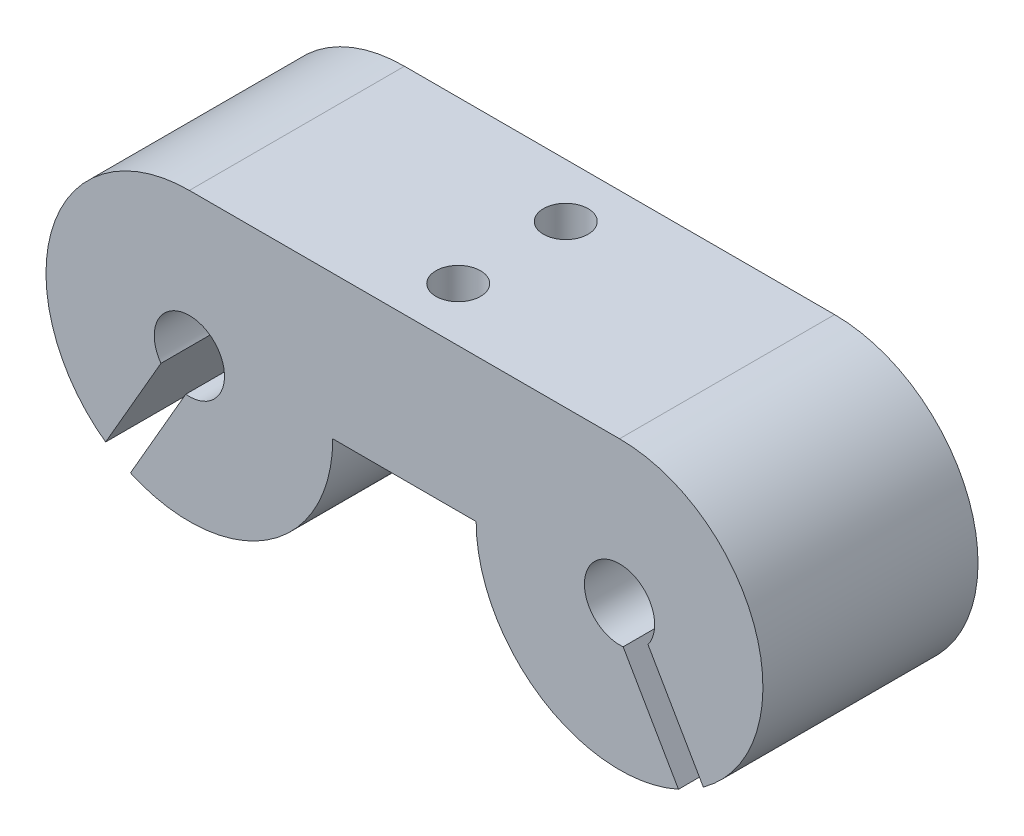
ISO-10303-21;
HEADER;
FILE_DESCRIPTION(('STEP AP214'),'2;1');
FILE_NAME('part.step','',(''),(''),'','','');
FILE_SCHEMA(('AUTOMOTIVE_DESIGN { 1 0 10303 214 1 1 1 1 }'));
ENDSEC;
DATA;
#1=APPLICATION_CONTEXT('core data for automotive mechanical design processes');
#2=APPLICATION_PROTOCOL_DEFINITION('international standard','automotive_design',2000,#1);
#3=PRODUCT_CONTEXT('',#1,'mechanical');
#4=PRODUCT('Part','Part','',(#3));
#5=PRODUCT_RELATED_PRODUCT_CATEGORY('part','',(#4));
#6=PRODUCT_DEFINITION_FORMATION('','',#4);
#7=PRODUCT_DEFINITION_CONTEXT('part definition',#1,'design');
#8=PRODUCT_DEFINITION('design','',#6,#7);
#9=PRODUCT_DEFINITION_SHAPE('','',#8);
#10=(LENGTH_UNIT() NAMED_UNIT(*) SI_UNIT(.MILLI.,.METRE.));
#11=(NAMED_UNIT(*) PLANE_ANGLE_UNIT() SI_UNIT($,.RADIAN.));
#12=(NAMED_UNIT(*) SI_UNIT($,.STERADIAN.) SOLID_ANGLE_UNIT());
#13=UNCERTAINTY_MEASURE_WITH_UNIT(LENGTH_MEASURE(1.E-05),#10,'distance_accuracy_value','');
#14=(GEOMETRIC_REPRESENTATION_CONTEXT(3) GLOBAL_UNCERTAINTY_ASSIGNED_CONTEXT((#13)) GLOBAL_UNIT_ASSIGNED_CONTEXT((#10,
#11,#12)) REPRESENTATION_CONTEXT('',''));
#15=CARTESIAN_POINT('',(0.,0.,0.));
#16=DIRECTION('',(0.,0.,1.));
#17=DIRECTION('',(1.,0.,0.));
#18=AXIS2_PLACEMENT_3D('',#15,#16,#17);
#19=CARTESIAN_POINT('',(15.,0.,15.));
#20=DIRECTION('',(0.,0.,-1.));
#21=DIRECTION('',(-1.,0.,0.));
#22=AXIS2_PLACEMENT_3D('',#19,#20,#21);
#23=CYLINDRICAL_SURFACE('',#22,10.);
#24=CARTESIAN_POINT('',(15.,0.,0.));
#25=DIRECTION('',(0.,0.,1.));
#26=DIRECTION('',(1.,0.,0.));
#27=AXIS2_PLACEMENT_3D('',#24,#25,#26);
#28=CIRCLE('',#27,10.);
#29=CARTESIAN_POINT('',(5.,0.,0.));
#30=VERTEX_POINT('',#29);
#31=CARTESIAN_POINT('',(19.1089117817486,-9.11684396980705,0.));
#32=VERTEX_POINT('',#31);
#33=EDGE_CURVE('E169',#30,#32,#28,.T.);
#34=ORIENTED_EDGE('',*,*,#33,.T.);
#35=DIRECTION('',(0.,0.,-1.));
#36=VECTOR('',#35,1.);
#37=CARTESIAN_POINT('',(19.1089117817486,-9.11684396980705,15.));
#38=LINE('',#37,#36);
#39=CARTESIAN_POINT('',(19.1089117817486,-9.11684396980705,15.));
#40=VERTEX_POINT('',#39);
#41=EDGE_CURVE('E207',#32,#40,#38,.F.);
#42=ORIENTED_EDGE('',*,*,#41,.T.);
#43=CARTESIAN_POINT('',(15.,0.,15.));
#44=DIRECTION('',(0.,0.,1.));
#45=DIRECTION('',(1.,0.,0.));
#46=AXIS2_PLACEMENT_3D('',#43,#44,#45);
#47=CIRCLE('',#46,10.);
#48=CARTESIAN_POINT('',(5.,0.,15.));
#49=VERTEX_POINT('',#48);
#50=EDGE_CURVE('E132',#49,#40,#47,.T.);
#51=ORIENTED_EDGE('',*,*,#50,.F.);
#52=DIRECTION('',(0.,0.,-1.));
#53=VECTOR('',#52,1.);
#54=CARTESIAN_POINT('',(5.,0.,15.));
#55=LINE('',#54,#53);
#56=EDGE_CURVE('E175',#49,#30,#55,.T.);
#57=ORIENTED_EDGE('',*,*,#56,.T.);
#58=EDGE_LOOP('',(#34,#42,#51,#57));
#59=FACE_BOUND('',#58,.T.);
#60=ADVANCED_FACE('F33',(#59),#23,.T.);
#61=CARTESIAN_POINT('',(-15.,0.,15.));
#62=DIRECTION('',(0.,0.,-1.));
#63=DIRECTION('',(-1.,0.,0.));
#64=AXIS2_PLACEMENT_3D('',#61,#62,#63);
#65=CYLINDRICAL_SURFACE('',#64,10.);
#66=CARTESIAN_POINT('',(-15.,0.,15.));
#67=DIRECTION('',(0.,0.,1.));
#68=DIRECTION('',(1.,0.,0.));
#69=AXIS2_PLACEMENT_3D('',#66,#67,#68);
#70=CIRCLE('',#69,10.);
#71=CARTESIAN_POINT('',(-19.1089117817487,-9.11684396980703,15.));
#72=VERTEX_POINT('',#71);
#73=CARTESIAN_POINT('',(-5.,0.,15.));
#74=VERTEX_POINT('',#73);
#75=EDGE_CURVE('E153',#72,#74,#70,.T.);
#76=ORIENTED_EDGE('',*,*,#75,.F.);
#77=DIRECTION('',(0.,0.,-1.));
#78=VECTOR('',#77,1.);
#79=CARTESIAN_POINT('',(-19.1089117817487,-9.11684396980702,15.));
#80=LINE('',#79,#78);
#81=CARTESIAN_POINT('',(-19.1089117817487,-9.11684396980703,0.));
#82=VERTEX_POINT('',#81);
#83=EDGE_CURVE('E137',#72,#82,#80,.T.);
#84=ORIENTED_EDGE('',*,*,#83,.T.);
#85=CARTESIAN_POINT('',(-15.,0.,0.));
#86=DIRECTION('',(0.,0.,1.));
#87=DIRECTION('',(1.,0.,0.));
#88=AXIS2_PLACEMENT_3D('',#85,#86,#87);
#89=CIRCLE('',#88,10.);
#90=CARTESIAN_POINT('',(-5.,0.,0.));
#91=VERTEX_POINT('',#90);
#92=EDGE_CURVE('E148',#82,#91,#89,.T.);
#93=ORIENTED_EDGE('',*,*,#92,.T.);
#94=DIRECTION('',(0.,0.,-1.));
#95=VECTOR('',#94,1.);
#96=CARTESIAN_POINT('',(-5.,0.,15.));
#97=LINE('',#96,#95);
#98=EDGE_CURVE('E178',#74,#91,#97,.T.);
#99=ORIENTED_EDGE('',*,*,#98,.F.);
#100=EDGE_LOOP('',(#76,#84,#93,#99));
#101=FACE_BOUND('',#100,.T.);
#102=ADVANCED_FACE('F264',(#101),#65,.T.);
#103=CARTESIAN_POINT('',(-15.,10.,0.));
#104=VERTEX_POINT('',#103);
#105=CARTESIAN_POINT('',(-20.8409625893176,-8.11684396980702,0.));
#106=VERTEX_POINT('',#105);
#107=EDGE_CURVE('E163',#104,#106,#89,.T.);
#108=ORIENTED_EDGE('',*,*,#107,.T.);
#109=DIRECTION('',(0.,0.,-1.));
#110=VECTOR('',#109,1.);
#111=CARTESIAN_POINT('',(-20.8409625893176,-8.11684396980702,15.));
#112=LINE('',#111,#110);
#113=CARTESIAN_POINT('',(-20.8409625893176,-8.11684396980702,15.));
#114=VERTEX_POINT('',#113);
#115=EDGE_CURVE('E142',#106,#114,#112,.F.);
#116=ORIENTED_EDGE('',*,*,#115,.T.);
#117=CARTESIAN_POINT('',(-15.,10.,15.));
#118=VERTEX_POINT('',#117);
#119=EDGE_CURVE('E155',#118,#114,#70,.T.);
#120=ORIENTED_EDGE('',*,*,#119,.F.);
#121=DIRECTION('',(0.,0.,-1.));
#122=VECTOR('',#121,1.);
#123=CARTESIAN_POINT('',(-15.,10.,15.));
#124=LINE('',#123,#122);
#125=EDGE_CURVE('E181',#118,#104,#124,.T.);
#126=ORIENTED_EDGE('',*,*,#125,.T.);
#127=EDGE_LOOP('',(#108,#116,#120,#126));
#128=FACE_BOUND('',#127,.T.);
#129=ADVANCED_FACE('F35',(#128),#65,.T.);
#130=CARTESIAN_POINT('',(-5.,0.,15.));
#131=DIRECTION('',(0.,1.,0.));
#132=DIRECTION('',(0.,0.,1.));
#133=AXIS2_PLACEMENT_3D('',#130,#131,#132);
#134=PLANE('',#133);
#135=CARTESIAN_POINT('',(0.,0.,3.75));
#136=DIRECTION('',(0.,-1.,0.));
#137=DIRECTION('',(0.,0.,-1.));
#138=AXIS2_PLACEMENT_3D('',#135,#136,#137);
#139=CIRCLE('',#138,1.55399999999999);
#140=CARTESIAN_POINT('',(0.,0.,2.19600000000001));
#141=VERTEX_POINT('',#140);
#142=EDGE_CURVE('E233',#141,#141,#139,.T.);
#143=ORIENTED_EDGE('',*,*,#142,.F.);
#144=EDGE_LOOP('',(#143));
#145=FACE_BOUND('',#144,.T.);
#146=CARTESIAN_POINT('',(0.,0.,11.25));
#147=DIRECTION('',(0.,-1.,0.));
#148=DIRECTION('',(0.,0.,-1.));
#149=AXIS2_PLACEMENT_3D('',#146,#147,#148);
#150=CIRCLE('',#149,1.55399999999999);
#151=CARTESIAN_POINT('',(0.,0.,9.69600000000001));
#152=VERTEX_POINT('',#151);
#153=EDGE_CURVE('E227',#152,#152,#150,.T.);
#154=ORIENTED_EDGE('',*,*,#153,.F.);
#155=EDGE_LOOP('',(#154));
#156=FACE_BOUND('',#155,.T.);
#157=DIRECTION('',(1.,0.,0.));
#158=VECTOR('',#157,1.);
#159=CARTESIAN_POINT('',(-5.,0.,0.));
#160=LINE('',#159,#158);
#161=EDGE_CURVE('E166',#91,#30,#160,.T.);
#162=ORIENTED_EDGE('',*,*,#161,.T.);
#163=ORIENTED_EDGE('',*,*,#56,.F.);
#164=DIRECTION('',(1.,0.,0.));
#165=VECTOR('',#164,1.);
#166=CARTESIAN_POINT('',(-5.,0.,15.));
#167=LINE('',#166,#165);
#168=EDGE_CURVE('E158',#74,#49,#167,.T.);
#169=ORIENTED_EDGE('',*,*,#168,.F.);
#170=ORIENTED_EDGE('',*,*,#98,.T.);
#171=EDGE_LOOP('',(#162,#163,#169,#170));
#172=FACE_BOUND('',#171,.T.);
#173=ADVANCED_FACE('F239',(#145,#156,#172),#134,.F.);
#174=CARTESIAN_POINT('',(20.8409625893175,-8.11684396980705,15.));
#175=VERTEX_POINT('',#174);
#176=CARTESIAN_POINT('',(15.,10.,15.));
#177=VERTEX_POINT('',#176);
#178=EDGE_CURVE('E160',#175,#177,#47,.T.);
#179=ORIENTED_EDGE('',*,*,#178,.F.);
#180=DIRECTION('',(0.,0.,-1.));
#181=VECTOR('',#180,1.);
#182=CARTESIAN_POINT('',(20.8409625893175,-8.11684396980705,15.));
#183=LINE('',#182,#181);
#184=CARTESIAN_POINT('',(20.8409625893175,-8.11684396980705,0.));
#185=VERTEX_POINT('',#184);
#186=EDGE_CURVE('E217',#175,#185,#183,.T.);
#187=ORIENTED_EDGE('',*,*,#186,.T.);
#188=CARTESIAN_POINT('',(15.,10.,0.));
#189=VERTEX_POINT('',#188);
#190=EDGE_CURVE('E168',#185,#189,#28,.T.);
#191=ORIENTED_EDGE('',*,*,#190,.T.);
#192=DIRECTION('',(0.,0.,-1.));
#193=VECTOR('',#192,1.);
#194=CARTESIAN_POINT('',(15.,10.,15.));
#195=LINE('',#194,#193);
#196=EDGE_CURVE('E162',#177,#189,#195,.T.);
#197=ORIENTED_EDGE('',*,*,#196,.F.);
#198=EDGE_LOOP('',(#179,#187,#191,#197));
#199=FACE_BOUND('',#198,.T.);
#200=ADVANCED_FACE('F242',(#199),#23,.T.);
#201=CARTESIAN_POINT('',(5.,10.,15.));
#202=DIRECTION('',(0.,-1.,0.));
#203=DIRECTION('',(1.,0.,0.));
#204=AXIS2_PLACEMENT_3D('',#201,#202,#203);
#205=PLANE('',#204);
#206=CARTESIAN_POINT('',(0.,10.,3.75));
#207=DIRECTION('',(0.,-1.,0.));
#208=DIRECTION('',(0.,0.,-1.));
#209=AXIS2_PLACEMENT_3D('',#206,#207,#208);
#210=CIRCLE('',#209,1.554);
#211=CARTESIAN_POINT('',(0.,10.,2.196));
#212=VERTEX_POINT('',#211);
#213=EDGE_CURVE('E230',#212,#212,#210,.T.);
#214=ORIENTED_EDGE('',*,*,#213,.T.);
#215=EDGE_LOOP('',(#214));
#216=FACE_BOUND('',#215,.T.);
#217=CARTESIAN_POINT('',(0.,10.,11.25));
#218=DIRECTION('',(0.,-1.,0.));
#219=DIRECTION('',(0.,0.,-1.));
#220=AXIS2_PLACEMENT_3D('',#217,#218,#219);
#221=CIRCLE('',#220,1.554);
#222=CARTESIAN_POINT('',(0.,10.,9.696));
#223=VERTEX_POINT('',#222);
#224=EDGE_CURVE('E133',#223,#223,#221,.T.);
#225=ORIENTED_EDGE('',*,*,#224,.T.);
#226=EDGE_LOOP('',(#225));
#227=FACE_BOUND('',#226,.T.);
#228=DIRECTION('',(-1.,0.,0.));
#229=VECTOR('',#228,1.);
#230=CARTESIAN_POINT('',(5.,10.,0.));
#231=LINE('',#230,#229);
#232=EDGE_CURVE('E154',#189,#104,#231,.T.);
#233=ORIENTED_EDGE('',*,*,#232,.T.);
#234=ORIENTED_EDGE('',*,*,#125,.F.);
#235=DIRECTION('',(-1.,0.,0.));
#236=VECTOR('',#235,1.);
#237=CARTESIAN_POINT('',(-5.,10.,15.));
#238=LINE('',#237,#236);
#239=EDGE_CURVE('E151',#177,#118,#238,.T.);
#240=ORIENTED_EDGE('',*,*,#239,.F.);
#241=ORIENTED_EDGE('',*,*,#196,.T.);
#242=EDGE_LOOP('',(#233,#234,#240,#241));
#243=FACE_BOUND('',#242,.T.);
#244=ADVANCED_FACE('F262',(#216,#227,#243),#205,.F.);
#245=CARTESIAN_POINT('',(15.,0.,15.));
#246=DIRECTION('',(0.,0.,1.));
#247=DIRECTION('',(1.,0.,0.));
#248=AXIS2_PLACEMENT_3D('',#245,#246,#247);
#249=PLANE('',#248);
#250=DIRECTION('',(0.499999999999998,-0.86602540378444,0.));
#251=VECTOR('',#250,1.);
#252=CARTESIAN_POINT('',(14.1339745962156,-0.499999999999997,15.));
#253=LINE('',#252,#251);
#254=CARTESIAN_POINT('',(15.2522880585328,-2.43697573552175,15.));
#255=VERTEX_POINT('',#254);
#256=EDGE_CURVE('E120',#255,#40,#253,.T.);
#257=ORIENTED_EDGE('',*,*,#256,.F.);
#258=CARTESIAN_POINT('',(15.,0.,15.));
#259=DIRECTION('',(0.,0.,1.));
#260=DIRECTION('',(1.,0.,0.));
#261=AXIS2_PLACEMENT_3D('',#258,#259,#260);
#262=CIRCLE('',#261,2.45);
#263=CARTESIAN_POINT('',(16.9843388661017,-1.43697573552175,15.));
#264=VERTEX_POINT('',#263);
#265=EDGE_CURVE('E130',#264,#255,#262,.T.);
#266=ORIENTED_EDGE('',*,*,#265,.F.);
#267=DIRECTION('',(-0.499999999999998,0.86602540378444,0.));
#268=VECTOR('',#267,1.);
#269=CARTESIAN_POINT('',(15.8660254037844,0.499999999999998,15.));
#270=LINE('',#269,#268);
#271=EDGE_CURVE('E48',#175,#264,#270,.T.);
#272=ORIENTED_EDGE('',*,*,#271,.F.);
#273=ORIENTED_EDGE('',*,*,#178,.T.);
#274=ORIENTED_EDGE('',*,*,#239,.T.);
#275=ORIENTED_EDGE('',*,*,#119,.T.);
#276=DIRECTION('',(-0.500000000000004,-0.866025403784436,0.));
#277=VECTOR('',#276,1.);
#278=CARTESIAN_POINT('',(-15.8660254037844,0.500000000000004,15.));
#279=LINE('',#278,#277);
#280=CARTESIAN_POINT('',(-16.9843388661017,-1.43697573552174,15.));
#281=VERTEX_POINT('',#280);
#282=EDGE_CURVE('E199',#281,#114,#279,.T.);
#283=ORIENTED_EDGE('',*,*,#282,.F.);
#284=CARTESIAN_POINT('',(-15.,0.,15.));
#285=DIRECTION('',(0.,0.,1.));
#286=DIRECTION('',(1.,0.,0.));
#287=AXIS2_PLACEMENT_3D('',#284,#285,#286);
#288=CIRCLE('',#287,2.45);
#289=CARTESIAN_POINT('',(-15.2522880585328,-2.43697573552174,15.));
#290=VERTEX_POINT('',#289);
#291=EDGE_CURVE('E139',#290,#281,#288,.T.);
#292=ORIENTED_EDGE('',*,*,#291,.F.);
#293=DIRECTION('',(0.500000000000004,0.866025403784436,0.));
#294=VECTOR('',#293,1.);
#295=CARTESIAN_POINT('',(-14.1339745962156,-0.500000000000002,15.));
#296=LINE('',#295,#294);
#297=EDGE_CURVE('E197',#72,#290,#296,.T.);
#298=ORIENTED_EDGE('',*,*,#297,.F.);
#299=ORIENTED_EDGE('',*,*,#75,.T.);
#300=ORIENTED_EDGE('',*,*,#168,.T.);
#301=ORIENTED_EDGE('',*,*,#50,.T.);
#302=EDGE_LOOP('',(#257,#266,#272,#273,#274,#275,#283,#292,#298,#299,#300,#301));
#303=FACE_BOUND('',#302,.T.);
#304=ADVANCED_FACE('F129',(#303),#249,.T.);
#305=CARTESIAN_POINT('',(15.,0.,0.));
#306=DIRECTION('',(0.,0.,1.));
#307=DIRECTION('',(1.,0.,0.));
#308=AXIS2_PLACEMENT_3D('',#305,#306,#307);
#309=PLANE('',#308);
#310=CARTESIAN_POINT('',(15.,0.,0.));
#311=DIRECTION('',(0.,0.,1.));
#312=DIRECTION('',(1.,0.,0.));
#313=AXIS2_PLACEMENT_3D('',#310,#311,#312);
#314=CIRCLE('',#313,2.45);
#315=CARTESIAN_POINT('',(16.9843388661017,-1.43697573552175,0.));
#316=VERTEX_POINT('',#315);
#317=CARTESIAN_POINT('',(15.2522880585328,-2.43697573552175,0.));
#318=VERTEX_POINT('',#317);
#319=EDGE_CURVE('E136',#316,#318,#314,.T.);
#320=ORIENTED_EDGE('',*,*,#319,.T.);
#321=DIRECTION('',(0.499999999999998,-0.86602540378444,0.));
#322=VECTOR('',#321,1.);
#323=CARTESIAN_POINT('',(14.1339745962156,-0.499999999999997,0.));
#324=LINE('',#323,#322);
#325=EDGE_CURVE('E56',#318,#32,#324,.T.);
#326=ORIENTED_EDGE('',*,*,#325,.T.);
#327=ORIENTED_EDGE('',*,*,#33,.F.);
#328=ORIENTED_EDGE('',*,*,#161,.F.);
#329=ORIENTED_EDGE('',*,*,#92,.F.);
#330=DIRECTION('',(0.500000000000004,0.866025403784436,0.));
#331=VECTOR('',#330,1.);
#332=CARTESIAN_POINT('',(-14.1339745962156,-0.500000000000002,0.));
#333=LINE('',#332,#331);
#334=CARTESIAN_POINT('',(-15.2522880585328,-2.43697573552174,0.));
#335=VERTEX_POINT('',#334);
#336=EDGE_CURVE('E203',#82,#335,#333,.T.);
#337=ORIENTED_EDGE('',*,*,#336,.T.);
#338=CARTESIAN_POINT('',(-15.,0.,0.));
#339=DIRECTION('',(0.,0.,1.));
#340=DIRECTION('',(1.,0.,0.));
#341=AXIS2_PLACEMENT_3D('',#338,#339,#340);
#342=CIRCLE('',#341,2.45);
#343=CARTESIAN_POINT('',(-16.9843388661017,-1.43697573552174,0.));
#344=VERTEX_POINT('',#343);
#345=EDGE_CURVE('E145',#335,#344,#342,.T.);
#346=ORIENTED_EDGE('',*,*,#345,.T.);
#347=DIRECTION('',(-0.500000000000004,-0.866025403784436,0.));
#348=VECTOR('',#347,1.);
#349=CARTESIAN_POINT('',(-15.8660254037844,0.500000000000004,0.));
#350=LINE('',#349,#348);
#351=EDGE_CURVE('E205',#344,#106,#350,.T.);
#352=ORIENTED_EDGE('',*,*,#351,.T.);
#353=ORIENTED_EDGE('',*,*,#107,.F.);
#354=ORIENTED_EDGE('',*,*,#232,.F.);
#355=ORIENTED_EDGE('',*,*,#190,.F.);
#356=DIRECTION('',(-0.499999999999998,0.86602540378444,0.));
#357=VECTOR('',#356,1.);
#358=CARTESIAN_POINT('',(15.8660254037844,0.499999999999998,0.));
#359=LINE('',#358,#357);
#360=EDGE_CURVE('E220',#185,#316,#359,.T.);
#361=ORIENTED_EDGE('',*,*,#360,.T.);
#362=EDGE_LOOP('',(#320,#326,#327,#328,#329,#337,#346,#352,#353,#354,#355,#361));
#363=FACE_BOUND('',#362,.T.);
#364=ADVANCED_FACE('F252',(#363),#309,.F.);
#365=CARTESIAN_POINT('',(-15.,0.,0.));
#366=DIRECTION('',(0.,0.,1.));
#367=DIRECTION('',(1.,0.,0.));
#368=AXIS2_PLACEMENT_3D('',#365,#366,#367);
#369=CYLINDRICAL_SURFACE('',#368,2.45);
#370=ORIENTED_EDGE('',*,*,#345,.F.);
#371=DIRECTION('',(0.,0.,1.));
#372=VECTOR('',#371,1.);
#373=CARTESIAN_POINT('',(-15.2522880585328,-2.43697573552174,0.));
#374=LINE('',#373,#372);
#375=EDGE_CURVE('E187',#335,#290,#374,.T.);
#376=ORIENTED_EDGE('',*,*,#375,.T.);
#377=ORIENTED_EDGE('',*,*,#291,.T.);
#378=DIRECTION('',(0.,0.,1.));
#379=VECTOR('',#378,1.);
#380=CARTESIAN_POINT('',(-16.9843388661017,-1.43697573552174,0.));
#381=LINE('',#380,#379);
#382=EDGE_CURVE('E184',#281,#344,#381,.F.);
#383=ORIENTED_EDGE('',*,*,#382,.T.);
#384=EDGE_LOOP('',(#370,#376,#377,#383));
#385=FACE_BOUND('',#384,.T.);
#386=ADVANCED_FACE('F192',(#385),#369,.F.);
#387=CARTESIAN_POINT('',(15.,0.,0.));
#388=DIRECTION('',(0.,0.,1.));
#389=DIRECTION('',(1.,0.,0.));
#390=AXIS2_PLACEMENT_3D('',#387,#388,#389);
#391=CYLINDRICAL_SURFACE('',#390,2.45);
#392=ORIENTED_EDGE('',*,*,#265,.T.);
#393=DIRECTION('',(0.,0.,1.));
#394=VECTOR('',#393,1.);
#395=CARTESIAN_POINT('',(15.2522880585328,-2.43697573552175,0.));
#396=LINE('',#395,#394);
#397=EDGE_CURVE('E11',#255,#318,#396,.F.);
#398=ORIENTED_EDGE('',*,*,#397,.T.);
#399=ORIENTED_EDGE('',*,*,#319,.F.);
#400=DIRECTION('',(0.,0.,1.));
#401=VECTOR('',#400,1.);
#402=CARTESIAN_POINT('',(16.9843388661017,-1.43697573552175,0.));
#403=LINE('',#402,#401);
#404=EDGE_CURVE('E41',#316,#264,#403,.T.);
#405=ORIENTED_EDGE('',*,*,#404,.T.);
#406=EDGE_LOOP('',(#392,#398,#399,#405));
#407=FACE_BOUND('',#406,.T.);
#408=ADVANCED_FACE('F135',(#407),#391,.F.);
#409=CARTESIAN_POINT('',(-15.8660254037844,0.500000000000004,0.));
#410=DIRECTION('',(-0.866025403784436,0.500000000000004,0.));
#411=DIRECTION('',(-0.500000000000004,-0.866025403784437,0.));
#412=AXIS2_PLACEMENT_3D('',#409,#410,#411);
#413=PLANE('',#412);
#414=ORIENTED_EDGE('',*,*,#351,.F.);
#415=ORIENTED_EDGE('',*,*,#382,.F.);
#416=ORIENTED_EDGE('',*,*,#282,.T.);
#417=ORIENTED_EDGE('',*,*,#115,.F.);
#418=EDGE_LOOP('',(#414,#415,#416,#417));
#419=FACE_BOUND('',#418,.T.);
#420=ADVANCED_FACE('F293',(#419),#413,.F.);
#421=CARTESIAN_POINT('',(-14.1339745962156,-0.500000000000002,0.));
#422=DIRECTION('',(0.866025403784436,-0.500000000000004,0.));
#423=DIRECTION('',(0.500000000000004,0.866025403784436,0.));
#424=AXIS2_PLACEMENT_3D('',#421,#422,#423);
#425=PLANE('',#424);
#426=ORIENTED_EDGE('',*,*,#297,.T.);
#427=ORIENTED_EDGE('',*,*,#375,.F.);
#428=ORIENTED_EDGE('',*,*,#336,.F.);
#429=ORIENTED_EDGE('',*,*,#83,.F.);
#430=EDGE_LOOP('',(#426,#427,#428,#429));
#431=FACE_BOUND('',#430,.T.);
#432=ADVANCED_FACE('F294',(#431),#425,.F.);
#433=CARTESIAN_POINT('',(15.8660254037844,0.499999999999998,0.));
#434=DIRECTION('',(0.86602540378444,0.499999999999998,0.));
#435=DIRECTION('',(-0.499999999999998,0.86602540378444,0.));
#436=AXIS2_PLACEMENT_3D('',#433,#434,#435);
#437=PLANE('',#436);
#438=ORIENTED_EDGE('',*,*,#271,.T.);
#439=ORIENTED_EDGE('',*,*,#404,.F.);
#440=ORIENTED_EDGE('',*,*,#360,.F.);
#441=ORIENTED_EDGE('',*,*,#186,.F.);
#442=EDGE_LOOP('',(#438,#439,#440,#441));
#443=FACE_BOUND('',#442,.T.);
#444=ADVANCED_FACE('F255',(#443),#437,.F.);
#445=CARTESIAN_POINT('',(14.1339745962156,-0.499999999999997,0.));
#446=DIRECTION('',(-0.86602540378444,-0.499999999999998,0.));
#447=DIRECTION('',(0.499999999999998,-0.86602540378444,0.));
#448=AXIS2_PLACEMENT_3D('',#445,#446,#447);
#449=PLANE('',#448);
#450=ORIENTED_EDGE('',*,*,#325,.F.);
#451=ORIENTED_EDGE('',*,*,#397,.F.);
#452=ORIENTED_EDGE('',*,*,#256,.T.);
#453=ORIENTED_EDGE('',*,*,#41,.F.);
#454=EDGE_LOOP('',(#450,#451,#452,#453));
#455=FACE_BOUND('',#454,.T.);
#456=ADVANCED_FACE('F119',(#455),#449,.F.);
#457=CARTESIAN_POINT('',(0.,0.,11.25));
#458=DIRECTION('',(0.,-1.,0.));
#459=DIRECTION('',(0.,0.,-1.));
#460=AXIS2_PLACEMENT_3D('',#457,#458,#459);
#461=CYLINDRICAL_SURFACE('',#460,1.55399999999999);
#462=ORIENTED_EDGE('',*,*,#224,.F.);
#463=EDGE_LOOP('',(#462));
#464=FACE_BOUND('',#463,.T.);
#465=ORIENTED_EDGE('',*,*,#153,.T.);
#466=EDGE_LOOP('',(#465));
#467=FACE_BOUND('',#466,.T.);
#468=ADVANCED_FACE('F301',(#464,#467),#461,.F.);
#469=CARTESIAN_POINT('',(0.,0.,3.75));
#470=DIRECTION('',(0.,-1.,0.));
#471=DIRECTION('',(0.,0.,-1.));
#472=AXIS2_PLACEMENT_3D('',#469,#470,#471);
#473=CYLINDRICAL_SURFACE('',#472,1.55399999999999);
#474=ORIENTED_EDGE('',*,*,#213,.F.);
#475=EDGE_LOOP('',(#474));
#476=FACE_BOUND('',#475,.T.);
#477=ORIENTED_EDGE('',*,*,#142,.T.);
#478=EDGE_LOOP('',(#477));
#479=FACE_BOUND('',#478,.T.);
#480=ADVANCED_FACE('F237',(#476,#479),#473,.F.);
#481=CLOSED_SHELL('',(#60,#102,#129,#173,#200,#244,#304,#364,#386,#408,#420,#432,#444,#456,#468,#480));
#482=MANIFOLD_SOLID_BREP('B2',#481);
#483=ADVANCED_BREP_SHAPE_REPRESENTATION('',(#18,#482),#14);
#484=SHAPE_DEFINITION_REPRESENTATION(#9,#483);
ENDSEC;
END-ISO-10303-21;
